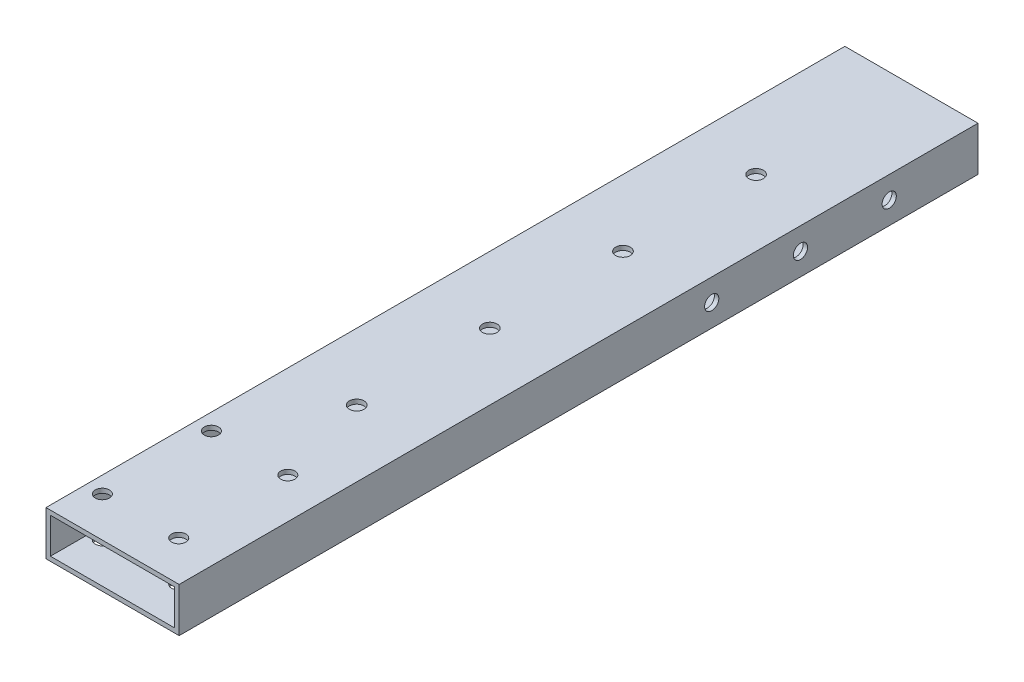
ISO-10303-21;
HEADER;
FILE_DESCRIPTION(('STEP AP214'),'2;1');
FILE_NAME('part.step','',(''),(''),'','','');
FILE_SCHEMA(('AUTOMOTIVE_DESIGN { 1 0 10303 214 1 1 1 1 }'));
ENDSEC;
DATA;
#1=APPLICATION_CONTEXT('core data for automotive mechanical design processes');
#2=APPLICATION_PROTOCOL_DEFINITION('international standard','automotive_design',2000,#1);
#3=PRODUCT_CONTEXT('',#1,'mechanical');
#4=PRODUCT('Part','Part','',(#3));
#5=PRODUCT_RELATED_PRODUCT_CATEGORY('part','',(#4));
#6=PRODUCT_DEFINITION_FORMATION('','',#4);
#7=PRODUCT_DEFINITION_CONTEXT('part definition',#1,'design');
#8=PRODUCT_DEFINITION('design','',#6,#7);
#9=PRODUCT_DEFINITION_SHAPE('','',#8);
#10=(LENGTH_UNIT() NAMED_UNIT(*) SI_UNIT(.MILLI.,.METRE.));
#11=(NAMED_UNIT(*) PLANE_ANGLE_UNIT() SI_UNIT($,.RADIAN.));
#12=(NAMED_UNIT(*) SI_UNIT($,.STERADIAN.) SOLID_ANGLE_UNIT());
#13=UNCERTAINTY_MEASURE_WITH_UNIT(LENGTH_MEASURE(1.E-05),#10,'distance_accuracy_value','');
#14=(GEOMETRIC_REPRESENTATION_CONTEXT(3) GLOBAL_UNCERTAINTY_ASSIGNED_CONTEXT((#13)) GLOBAL_UNIT_ASSIGNED_CONTEXT((#10,
#11,#12)) REPRESENTATION_CONTEXT('',''));
#15=CARTESIAN_POINT('',(0.,0.,0.));
#16=DIRECTION('',(0.,0.,1.));
#17=DIRECTION('',(1.,0.,0.));
#18=AXIS2_PLACEMENT_3D('',#15,#16,#17);
#19=CARTESIAN_POINT('',(15.,5.,330.));
#20=DIRECTION('',(-1.,0.,0.));
#21=DIRECTION('',(0.,0.,1.));
#22=AXIS2_PLACEMENT_3D('',#19,#20,#21);
#23=PLANE('',#22);
#24=CARTESIAN_POINT('',(15.,0.,210.));
#25=DIRECTION('',(-1.,0.,0.));
#26=DIRECTION('',(0.,0.,1.));
#27=AXIS2_PLACEMENT_3D('',#24,#25,#26);
#28=CIRCLE('',#27,1.59999999999996);
#29=CARTESIAN_POINT('',(15.,0.,211.6));
#30=VERTEX_POINT('',#29);
#31=EDGE_CURVE('E230',#30,#30,#28,.T.);
#32=ORIENTED_EDGE('',*,*,#31,.T.);
#33=EDGE_LOOP('',(#32));
#34=FACE_BOUND('',#33,.T.);
#35=CARTESIAN_POINT('',(15.,0.,190.));
#36=DIRECTION('',(-1.,0.,0.));
#37=DIRECTION('',(0.,0.,1.));
#38=AXIS2_PLACEMENT_3D('',#35,#36,#37);
#39=CIRCLE('',#38,1.60000000000002);
#40=CARTESIAN_POINT('',(15.,0.,191.6));
#41=VERTEX_POINT('',#40);
#42=EDGE_CURVE('E241',#41,#41,#39,.T.);
#43=ORIENTED_EDGE('',*,*,#42,.T.);
#44=EDGE_LOOP('',(#43));
#45=FACE_BOUND('',#44,.T.);
#46=CARTESIAN_POINT('',(15.,0.,170.));
#47=DIRECTION('',(-1.,0.,0.));
#48=DIRECTION('',(0.,0.,1.));
#49=AXIS2_PLACEMENT_3D('',#46,#47,#48);
#50=CIRCLE('',#49,1.59999999999999);
#51=CARTESIAN_POINT('',(15.,0.,171.6));
#52=VERTEX_POINT('',#51);
#53=EDGE_CURVE('E231',#52,#52,#50,.T.);
#54=ORIENTED_EDGE('',*,*,#53,.T.);
#55=EDGE_LOOP('',(#54));
#56=FACE_BOUND('',#55,.T.);
#57=DIRECTION('',(0.,-1.,0.));
#58=VECTOR('',#57,1.);
#59=CARTESIAN_POINT('',(15.,5.,150.));
#60=LINE('',#59,#58);
#61=CARTESIAN_POINT('',(15.,5.,150.));
#62=VERTEX_POINT('',#61);
#63=CARTESIAN_POINT('',(15.,-5.,150.));
#64=VERTEX_POINT('',#63);
#65=EDGE_CURVE('E55',#62,#64,#60,.T.);
#66=ORIENTED_EDGE('',*,*,#65,.F.);
#67=DIRECTION('',(0.,0.,-1.));
#68=VECTOR('',#67,1.);
#69=CARTESIAN_POINT('',(15.,5.,330.));
#70=LINE('',#69,#68);
#71=CARTESIAN_POINT('',(15.,5.,330.));
#72=VERTEX_POINT('',#71);
#73=EDGE_CURVE('E48',#72,#62,#70,.T.);
#74=ORIENTED_EDGE('',*,*,#73,.F.);
#75=DIRECTION('',(0.,1.,0.));
#76=VECTOR('',#75,1.);
#77=CARTESIAN_POINT('',(15.,5.,330.));
#78=LINE('',#77,#76);
#79=CARTESIAN_POINT('',(15.,-5.,330.));
#80=VERTEX_POINT('',#79);
#81=EDGE_CURVE('E282',#80,#72,#78,.T.);
#82=ORIENTED_EDGE('',*,*,#81,.F.);
#83=DIRECTION('',(0.,0.,-1.));
#84=VECTOR('',#83,1.);
#85=CARTESIAN_POINT('',(15.,-5.,330.));
#86=LINE('',#85,#84);
#87=EDGE_CURVE('E124',#80,#64,#86,.T.);
#88=ORIENTED_EDGE('',*,*,#87,.T.);
#89=EDGE_LOOP('',(#66,#74,#82,#88));
#90=FACE_BOUND('',#89,.T.);
#91=ADVANCED_FACE('F41',(#34,#45,#56,#90),#23,.F.);
#92=CARTESIAN_POINT('',(-15.,5.,330.));
#93=DIRECTION('',(0.,-1.,0.));
#94=DIRECTION('',(0.,0.,-1.));
#95=AXIS2_PLACEMENT_3D('',#92,#93,#94);
#96=PLANE('',#95);
#97=CARTESIAN_POINT('',(-11.3,5.,321.));
#98=DIRECTION('',(0.,1.,0.));
#99=DIRECTION('',(0.,0.,1.));
#100=AXIS2_PLACEMENT_3D('',#97,#98,#99);
#101=CIRCLE('',#100,1.59999999999998);
#102=CARTESIAN_POINT('',(-11.3,5.,322.6));
#103=VERTEX_POINT('',#102);
#104=EDGE_CURVE('E252',#103,#103,#101,.T.);
#105=ORIENTED_EDGE('',*,*,#104,.F.);
#106=EDGE_LOOP('',(#105));
#107=FACE_BOUND('',#106,.T.);
#108=CARTESIAN_POINT('',(-6.66133814775094E-12,5.,245.));
#109=DIRECTION('',(0.,1.,0.));
#110=DIRECTION('',(0.,0.,1.));
#111=AXIS2_PLACEMENT_3D('',#108,#109,#110);
#112=CIRCLE('',#111,1.65000000000881);
#113=CARTESIAN_POINT('',(-6.66133814775094E-12,5.,246.650000000009));
#114=VERTEX_POINT('',#113);
#115=EDGE_CURVE('E274',#114,#114,#112,.T.);
#116=ORIENTED_EDGE('',*,*,#115,.F.);
#117=EDGE_LOOP('',(#116));
#118=FACE_BOUND('',#117,.T.);
#119=CARTESIAN_POINT('',(-6.43929354282591E-12,5.,275.));
#120=DIRECTION('',(0.,1.,0.));
#121=DIRECTION('',(0.,0.,1.));
#122=AXIS2_PLACEMENT_3D('',#119,#120,#121);
#123=CIRCLE('',#122,1.6500000000061);
#124=CARTESIAN_POINT('',(-6.43929354282591E-12,5.,276.650000000006));
#125=VERTEX_POINT('',#124);
#126=EDGE_CURVE('E268',#125,#125,#123,.T.);
#127=ORIENTED_EDGE('',*,*,#126,.F.);
#128=EDGE_LOOP('',(#127));
#129=FACE_BOUND('',#128,.T.);
#130=CARTESIAN_POINT('',(-6.66133814775094E-12,5.,185.));
#131=DIRECTION('',(0.,1.,0.));
#132=DIRECTION('',(0.,0.,1.));
#133=AXIS2_PLACEMENT_3D('',#130,#131,#132);
#134=CIRCLE('',#133,1.65000000000584);
#135=CARTESIAN_POINT('',(-6.66133814775094E-12,5.,186.650000000006));
#136=VERTEX_POINT('',#135);
#137=EDGE_CURVE('E262',#136,#136,#134,.T.);
#138=ORIENTED_EDGE('',*,*,#137,.F.);
#139=EDGE_LOOP('',(#138));
#140=FACE_BOUND('',#139,.T.);
#141=CARTESIAN_POINT('',(-6.43929354282591E-12,5.,215.));
#142=DIRECTION('',(0.,1.,0.));
#143=DIRECTION('',(0.,0.,1.));
#144=AXIS2_PLACEMENT_3D('',#141,#142,#143);
#145=CIRCLE('',#144,1.65000000000618);
#146=CARTESIAN_POINT('',(-6.43929354282591E-12,5.,216.650000000006));
#147=VERTEX_POINT('',#146);
#148=EDGE_CURVE('E256',#147,#147,#145,.T.);
#149=ORIENTED_EDGE('',*,*,#148,.F.);
#150=EDGE_LOOP('',(#149));
#151=FACE_BOUND('',#150,.T.);
#152=CARTESIAN_POINT('',(5.90729309052507,5.,296.425438671338));
#153=DIRECTION('',(0.,1.,0.));
#154=DIRECTION('',(0.,0.,1.));
#155=AXIS2_PLACEMENT_3D('',#152,#153,#154);
#156=CIRCLE('',#155,1.60000000000869);
#157=CARTESIAN_POINT('',(5.90729309052507,5.,298.025438671347));
#158=VERTEX_POINT('',#157);
#159=EDGE_CURVE('E253',#158,#158,#156,.T.);
#160=ORIENTED_EDGE('',*,*,#159,.F.);
#161=EDGE_LOOP('',(#160));
#162=FACE_BOUND('',#161,.T.);
#163=CARTESIAN_POINT('',(-11.3,5.,296.425438671338));
#164=DIRECTION('',(0.,1.,0.));
#165=DIRECTION('',(0.,0.,1.));
#166=AXIS2_PLACEMENT_3D('',#163,#164,#165);
#167=CIRCLE('',#166,1.6);
#168=CARTESIAN_POINT('',(-11.3,5.,298.025438671338));
#169=VERTEX_POINT('',#168);
#170=EDGE_CURVE('E304',#169,#169,#167,.T.);
#171=ORIENTED_EDGE('',*,*,#170,.F.);
#172=EDGE_LOOP('',(#171));
#173=FACE_BOUND('',#172,.T.);
#174=CARTESIAN_POINT('',(5.90729309052507,5.,321.));
#175=DIRECTION('',(0.,1.,0.));
#176=DIRECTION('',(0.,0.,1.));
#177=AXIS2_PLACEMENT_3D('',#174,#175,#176);
#178=CIRCLE('',#177,1.59999999999999);
#179=CARTESIAN_POINT('',(5.90729309052507,5.,322.6));
#180=VERTEX_POINT('',#179);
#181=EDGE_CURVE('E155',#180,#180,#178,.T.);
#182=ORIENTED_EDGE('',*,*,#181,.F.);
#183=EDGE_LOOP('',(#182));
#184=FACE_BOUND('',#183,.T.);
#185=DIRECTION('',(1.,0.,0.));
#186=VECTOR('',#185,1.);
#187=CARTESIAN_POINT('',(15.,5.,150.));
#188=LINE('',#187,#186);
#189=CARTESIAN_POINT('',(-15.,5.,150.));
#190=VERTEX_POINT('',#189);
#191=EDGE_CURVE('E120',#190,#62,#188,.T.);
#192=ORIENTED_EDGE('',*,*,#191,.F.);
#193=DIRECTION('',(0.,0.,-1.));
#194=VECTOR('',#193,1.);
#195=CARTESIAN_POINT('',(-15.,5.,330.));
#196=LINE('',#195,#194);
#197=CARTESIAN_POINT('',(-15.,5.,330.));
#198=VERTEX_POINT('',#197);
#199=EDGE_CURVE('E119',#198,#190,#196,.T.);
#200=ORIENTED_EDGE('',*,*,#199,.F.);
#201=DIRECTION('',(-1.,0.,0.));
#202=VECTOR('',#201,1.);
#203=CARTESIAN_POINT('',(-15.,5.,330.));
#204=LINE('',#203,#202);
#205=EDGE_CURVE('E287',#72,#198,#204,.T.);
#206=ORIENTED_EDGE('',*,*,#205,.F.);
#207=ORIENTED_EDGE('',*,*,#73,.T.);
#208=EDGE_LOOP('',(#192,#200,#206,#207));
#209=FACE_BOUND('',#208,.T.);
#210=ADVANCED_FACE('F296',(#107,#118,#129,#140,#151,#162,#173,#184,#209),#96,.F.);
#211=CARTESIAN_POINT('',(-15.,5.,330.));
#212=DIRECTION('',(1.,0.,0.));
#213=DIRECTION('',(0.,1.,0.));
#214=AXIS2_PLACEMENT_3D('',#211,#212,#213);
#215=PLANE('',#214);
#216=CARTESIAN_POINT('',(-15.,0.,210.));
#217=DIRECTION('',(-1.,0.,0.));
#218=DIRECTION('',(0.,0.,1.));
#219=AXIS2_PLACEMENT_3D('',#216,#217,#218);
#220=CIRCLE('',#219,1.59999999999996);
#221=CARTESIAN_POINT('',(-15.,0.,211.6));
#222=VERTEX_POINT('',#221);
#223=EDGE_CURVE('E244',#222,#222,#220,.T.);
#224=ORIENTED_EDGE('',*,*,#223,.F.);
#225=EDGE_LOOP('',(#224));
#226=FACE_BOUND('',#225,.T.);
#227=CARTESIAN_POINT('',(-15.,0.,190.));
#228=DIRECTION('',(-1.,0.,0.));
#229=DIRECTION('',(0.,0.,1.));
#230=AXIS2_PLACEMENT_3D('',#227,#228,#229);
#231=CIRCLE('',#230,1.60000000000002);
#232=CARTESIAN_POINT('',(-15.,0.,191.6));
#233=VERTEX_POINT('',#232);
#234=EDGE_CURVE('E238',#233,#233,#231,.T.);
#235=ORIENTED_EDGE('',*,*,#234,.F.);
#236=EDGE_LOOP('',(#235));
#237=FACE_BOUND('',#236,.T.);
#238=CARTESIAN_POINT('',(-15.,0.,170.));
#239=DIRECTION('',(-1.,0.,0.));
#240=DIRECTION('',(0.,0.,1.));
#241=AXIS2_PLACEMENT_3D('',#238,#239,#240);
#242=CIRCLE('',#241,1.59999999999999);
#243=CARTESIAN_POINT('',(-15.,0.,171.6));
#244=VERTEX_POINT('',#243);
#245=EDGE_CURVE('E235',#244,#244,#242,.T.);
#246=ORIENTED_EDGE('',*,*,#245,.F.);
#247=EDGE_LOOP('',(#246));
#248=FACE_BOUND('',#247,.T.);
#249=DIRECTION('',(0.,1.,0.));
#250=VECTOR('',#249,1.);
#251=CARTESIAN_POINT('',(-15.,5.,150.));
#252=LINE('',#251,#250);
#253=CARTESIAN_POINT('',(-15.,-5.,150.));
#254=VERTEX_POINT('',#253);
#255=EDGE_CURVE('E104',#254,#190,#252,.T.);
#256=ORIENTED_EDGE('',*,*,#255,.F.);
#257=DIRECTION('',(0.,0.,-1.));
#258=VECTOR('',#257,1.);
#259=CARTESIAN_POINT('',(-15.,-5.,330.));
#260=LINE('',#259,#258);
#261=CARTESIAN_POINT('',(-15.,-5.,330.));
#262=VERTEX_POINT('',#261);
#263=EDGE_CURVE('E116',#262,#254,#260,.T.);
#264=ORIENTED_EDGE('',*,*,#263,.F.);
#265=DIRECTION('',(0.,-1.,0.));
#266=VECTOR('',#265,1.);
#267=CARTESIAN_POINT('',(-15.,5.,330.));
#268=LINE('',#267,#266);
#269=EDGE_CURVE('E289',#198,#262,#268,.T.);
#270=ORIENTED_EDGE('',*,*,#269,.F.);
#271=ORIENTED_EDGE('',*,*,#199,.T.);
#272=EDGE_LOOP('',(#256,#264,#270,#271));
#273=FACE_BOUND('',#272,.T.);
#274=ADVANCED_FACE('F114',(#226,#237,#248,#273),#215,.F.);
#275=CARTESIAN_POINT('',(-15.,-5.,330.));
#276=DIRECTION('',(0.,1.,0.));
#277=DIRECTION('',(0.,0.,1.));
#278=AXIS2_PLACEMENT_3D('',#275,#276,#277);
#279=PLANE('',#278);
#280=CARTESIAN_POINT('',(-11.3,-5.,321.));
#281=DIRECTION('',(0.,1.,0.));
#282=DIRECTION('',(0.,0.,1.));
#283=AXIS2_PLACEMENT_3D('',#280,#281,#282);
#284=CIRCLE('',#283,1.59999999999998);
#285=CARTESIAN_POINT('',(-11.3,-5.,322.6));
#286=VERTEX_POINT('',#285);
#287=EDGE_CURVE('E279',#286,#286,#284,.T.);
#288=ORIENTED_EDGE('',*,*,#287,.T.);
#289=EDGE_LOOP('',(#288));
#290=FACE_BOUND('',#289,.T.);
#291=CARTESIAN_POINT('',(-6.66133814775094E-12,-5.,245.));
#292=DIRECTION('',(0.,1.,0.));
#293=DIRECTION('',(0.,0.,1.));
#294=AXIS2_PLACEMENT_3D('',#291,#292,#293);
#295=CIRCLE('',#294,1.65000000000881);
#296=CARTESIAN_POINT('',(-6.66133814775094E-12,-5.,246.650000000009));
#297=VERTEX_POINT('',#296);
#298=EDGE_CURVE('E234',#297,#297,#295,.T.);
#299=ORIENTED_EDGE('',*,*,#298,.T.);
#300=EDGE_LOOP('',(#299));
#301=FACE_BOUND('',#300,.T.);
#302=CARTESIAN_POINT('',(-6.43929354282591E-12,-5.,275.));
#303=DIRECTION('',(0.,1.,0.));
#304=DIRECTION('',(0.,0.,1.));
#305=AXIS2_PLACEMENT_3D('',#302,#303,#304);
#306=CIRCLE('',#305,1.6500000000061);
#307=CARTESIAN_POINT('',(-6.43929354282591E-12,-5.,276.650000000006));
#308=VERTEX_POINT('',#307);
#309=EDGE_CURVE('E271',#308,#308,#306,.T.);
#310=ORIENTED_EDGE('',*,*,#309,.T.);
#311=EDGE_LOOP('',(#310));
#312=FACE_BOUND('',#311,.T.);
#313=CARTESIAN_POINT('',(-6.66133814775094E-12,-5.,185.));
#314=DIRECTION('',(0.,1.,0.));
#315=DIRECTION('',(0.,0.,1.));
#316=AXIS2_PLACEMENT_3D('',#313,#314,#315);
#317=CIRCLE('',#316,1.65000000000584);
#318=CARTESIAN_POINT('',(-6.66133814775094E-12,-5.,186.650000000006));
#319=VERTEX_POINT('',#318);
#320=EDGE_CURVE('E265',#319,#319,#317,.T.);
#321=ORIENTED_EDGE('',*,*,#320,.T.);
#322=EDGE_LOOP('',(#321));
#323=FACE_BOUND('',#322,.T.);
#324=CARTESIAN_POINT('',(-6.43929354282591E-12,-5.,215.));
#325=DIRECTION('',(0.,1.,0.));
#326=DIRECTION('',(0.,0.,1.));
#327=AXIS2_PLACEMENT_3D('',#324,#325,#326);
#328=CIRCLE('',#327,1.65000000000618);
#329=CARTESIAN_POINT('',(-6.43929354282591E-12,-5.,216.650000000006));
#330=VERTEX_POINT('',#329);
#331=EDGE_CURVE('E259',#330,#330,#328,.T.);
#332=ORIENTED_EDGE('',*,*,#331,.T.);
#333=EDGE_LOOP('',(#332));
#334=FACE_BOUND('',#333,.T.);
#335=CARTESIAN_POINT('',(5.90729309052507,-5.,296.425438671338));
#336=DIRECTION('',(0.,1.,0.));
#337=DIRECTION('',(0.,0.,1.));
#338=AXIS2_PLACEMENT_3D('',#335,#336,#337);
#339=CIRCLE('',#338,1.60000000000869);
#340=CARTESIAN_POINT('',(5.90729309052507,-5.,298.025438671347));
#341=VERTEX_POINT('',#340);
#342=EDGE_CURVE('E249',#341,#341,#339,.T.);
#343=ORIENTED_EDGE('',*,*,#342,.T.);
#344=EDGE_LOOP('',(#343));
#345=FACE_BOUND('',#344,.T.);
#346=CARTESIAN_POINT('',(-11.3,-5.,296.425438671338));
#347=DIRECTION('',(0.,1.,0.));
#348=DIRECTION('',(0.,0.,1.));
#349=AXIS2_PLACEMENT_3D('',#346,#347,#348);
#350=CIRCLE('',#349,1.6);
#351=CARTESIAN_POINT('',(-11.3,-5.,298.025438671338));
#352=VERTEX_POINT('',#351);
#353=EDGE_CURVE('E159',#352,#352,#350,.T.);
#354=ORIENTED_EDGE('',*,*,#353,.T.);
#355=EDGE_LOOP('',(#354));
#356=FACE_BOUND('',#355,.T.);
#357=CARTESIAN_POINT('',(5.90729309052507,-5.,321.));
#358=DIRECTION('',(0.,1.,0.));
#359=DIRECTION('',(0.,0.,1.));
#360=AXIS2_PLACEMENT_3D('',#357,#358,#359);
#361=CIRCLE('',#360,1.59999999999999);
#362=CARTESIAN_POINT('',(5.90729309052507,-5.,322.6));
#363=VERTEX_POINT('',#362);
#364=EDGE_CURVE('E163',#363,#363,#361,.T.);
#365=ORIENTED_EDGE('',*,*,#364,.T.);
#366=EDGE_LOOP('',(#365));
#367=FACE_BOUND('',#366,.T.);
#368=DIRECTION('',(-1.,0.,0.));
#369=VECTOR('',#368,1.);
#370=CARTESIAN_POINT('',(15.,-5.,150.));
#371=LINE('',#370,#369);
#372=EDGE_CURVE('E101',#64,#254,#371,.T.);
#373=ORIENTED_EDGE('',*,*,#372,.F.);
#374=ORIENTED_EDGE('',*,*,#87,.F.);
#375=DIRECTION('',(1.,0.,0.));
#376=VECTOR('',#375,1.);
#377=CARTESIAN_POINT('',(-15.,-5.,330.));
#378=LINE('',#377,#376);
#379=EDGE_CURVE('E123',#262,#80,#378,.T.);
#380=ORIENTED_EDGE('',*,*,#379,.F.);
#381=ORIENTED_EDGE('',*,*,#263,.T.);
#382=EDGE_LOOP('',(#373,#374,#380,#381));
#383=FACE_BOUND('',#382,.T.);
#384=ADVANCED_FACE('F122',(#290,#301,#312,#323,#334,#345,#356,#367,#383),#279,.F.);
#385=CARTESIAN_POINT('',(14.,-4.,355.));
#386=DIRECTION('',(0.,-1.,0.));
#387=DIRECTION('',(0.,0.,-1.));
#388=AXIS2_PLACEMENT_3D('',#385,#386,#387);
#389=PLANE('',#388);
#390=CARTESIAN_POINT('',(-11.3,-4.,321.));
#391=DIRECTION('',(0.,-1.,0.));
#392=DIRECTION('',(0.,0.,-1.));
#393=AXIS2_PLACEMENT_3D('',#390,#391,#392);
#394=CIRCLE('',#393,1.59999999999998);
#395=CARTESIAN_POINT('',(-11.3,-4.,319.4));
#396=VERTEX_POINT('',#395);
#397=EDGE_CURVE('E225',#396,#396,#394,.F.);
#398=ORIENTED_EDGE('',*,*,#397,.F.);
#399=EDGE_LOOP('',(#398));
#400=FACE_BOUND('',#399,.T.);
#401=CARTESIAN_POINT('',(-6.43929354282591E-12,-4.,275.));
#402=DIRECTION('',(0.,-1.,0.));
#403=DIRECTION('',(0.,0.,-1.));
#404=AXIS2_PLACEMENT_3D('',#401,#402,#403);
#405=CIRCLE('',#404,1.6500000000061);
#406=CARTESIAN_POINT('',(-6.43929354282591E-12,-4.,273.349999999994));
#407=VERTEX_POINT('',#406);
#408=EDGE_CURVE('E219',#407,#407,#405,.F.);
#409=ORIENTED_EDGE('',*,*,#408,.F.);
#410=EDGE_LOOP('',(#409));
#411=FACE_BOUND('',#410,.T.);
#412=CARTESIAN_POINT('',(-6.43929354282591E-12,-4.,215.));
#413=DIRECTION('',(0.,-1.,0.));
#414=DIRECTION('',(0.,0.,-1.));
#415=AXIS2_PLACEMENT_3D('',#412,#413,#414);
#416=CIRCLE('',#415,1.65000000000618);
#417=CARTESIAN_POINT('',(-6.43929354282591E-12,-4.,213.349999999994));
#418=VERTEX_POINT('',#417);
#419=EDGE_CURVE('E150',#418,#418,#416,.F.);
#420=ORIENTED_EDGE('',*,*,#419,.F.);
#421=EDGE_LOOP('',(#420));
#422=FACE_BOUND('',#421,.T.);
#423=CARTESIAN_POINT('',(5.90729309052507,-4.,296.425438671338));
#424=DIRECTION('',(0.,-1.,0.));
#425=DIRECTION('',(0.,0.,-1.));
#426=AXIS2_PLACEMENT_3D('',#423,#424,#425);
#427=CIRCLE('',#426,1.60000000000869);
#428=CARTESIAN_POINT('',(5.90729309052507,-4.,294.82543867133));
#429=VERTEX_POINT('',#428);
#430=EDGE_CURVE('E147',#429,#429,#427,.F.);
#431=ORIENTED_EDGE('',*,*,#430,.F.);
#432=EDGE_LOOP('',(#431));
#433=FACE_BOUND('',#432,.T.);
#434=CARTESIAN_POINT('',(-6.66133814775094E-12,-4.,185.));
#435=DIRECTION('',(0.,-1.,0.));
#436=DIRECTION('',(0.,0.,-1.));
#437=AXIS2_PLACEMENT_3D('',#434,#435,#436);
#438=CIRCLE('',#437,1.65000000000584);
#439=CARTESIAN_POINT('',(-6.66133814775094E-12,-4.,183.349999999994));
#440=VERTEX_POINT('',#439);
#441=EDGE_CURVE('E216',#440,#440,#438,.F.);
#442=ORIENTED_EDGE('',*,*,#441,.F.);
#443=EDGE_LOOP('',(#442));
#444=FACE_BOUND('',#443,.T.);
#445=CARTESIAN_POINT('',(-6.66133814775094E-12,-4.,245.));
#446=DIRECTION('',(0.,-1.,0.));
#447=DIRECTION('',(0.,0.,-1.));
#448=AXIS2_PLACEMENT_3D('',#445,#446,#447);
#449=CIRCLE('',#448,1.65000000000881);
#450=CARTESIAN_POINT('',(-6.66133814775094E-12,-4.,243.349999999991));
#451=VERTEX_POINT('',#450);
#452=EDGE_CURVE('E222',#451,#451,#449,.F.);
#453=ORIENTED_EDGE('',*,*,#452,.F.);
#454=EDGE_LOOP('',(#453));
#455=FACE_BOUND('',#454,.T.);
#456=CARTESIAN_POINT('',(-11.3,-4.,296.425438671338));
#457=DIRECTION('',(0.,-1.,0.));
#458=DIRECTION('',(0.,0.,-1.));
#459=AXIS2_PLACEMENT_3D('',#456,#457,#458);
#460=CIRCLE('',#459,1.6);
#461=CARTESIAN_POINT('',(-11.3,-4.,294.825438671338));
#462=VERTEX_POINT('',#461);
#463=EDGE_CURVE('E154',#462,#462,#460,.T.);
#464=ORIENTED_EDGE('',*,*,#463,.T.);
#465=EDGE_LOOP('',(#464));
#466=FACE_BOUND('',#465,.T.);
#467=CARTESIAN_POINT('',(5.90729309052507,-4.,321.));
#468=DIRECTION('',(0.,-1.,0.));
#469=DIRECTION('',(0.,0.,-1.));
#470=AXIS2_PLACEMENT_3D('',#467,#468,#469);
#471=CIRCLE('',#470,1.59999999999999);
#472=CARTESIAN_POINT('',(5.90729309052507,-4.,319.4));
#473=VERTEX_POINT('',#472);
#474=EDGE_CURVE('E158',#473,#473,#471,.T.);
#475=ORIENTED_EDGE('',*,*,#474,.T.);
#476=EDGE_LOOP('',(#475));
#477=FACE_BOUND('',#476,.T.);
#478=DIRECTION('',(1.,0.,0.));
#479=VECTOR('',#478,1.);
#480=CARTESIAN_POINT('',(14.,-4.,150.));
#481=LINE('',#480,#479);
#482=CARTESIAN_POINT('',(-14.,-4.,150.));
#483=VERTEX_POINT('',#482);
#484=CARTESIAN_POINT('',(14.,-4.,150.));
#485=VERTEX_POINT('',#484);
#486=EDGE_CURVE('E62',#483,#485,#481,.T.);
#487=ORIENTED_EDGE('',*,*,#486,.F.);
#488=DIRECTION('',(0.,0.,-1.));
#489=VECTOR('',#488,1.);
#490=CARTESIAN_POINT('',(-14.,-4.,355.));
#491=LINE('',#490,#489);
#492=CARTESIAN_POINT('',(-14.,-4.,330.));
#493=VERTEX_POINT('',#492);
#494=EDGE_CURVE('E181',#493,#483,#491,.T.);
#495=ORIENTED_EDGE('',*,*,#494,.F.);
#496=DIRECTION('',(1.,0.,0.));
#497=VECTOR('',#496,1.);
#498=CARTESIAN_POINT('',(0.,-4.,330.));
#499=LINE('',#498,#497);
#500=CARTESIAN_POINT('',(14.,-4.,330.));
#501=VERTEX_POINT('',#500);
#502=EDGE_CURVE('E228',#493,#501,#499,.T.);
#503=ORIENTED_EDGE('',*,*,#502,.T.);
#504=DIRECTION('',(0.,0.,-1.));
#505=VECTOR('',#504,1.);
#506=CARTESIAN_POINT('',(14.,-4.,355.));
#507=LINE('',#506,#505);
#508=EDGE_CURVE('E175',#501,#485,#507,.T.);
#509=ORIENTED_EDGE('',*,*,#508,.T.);
#510=EDGE_LOOP('',(#487,#495,#503,#509));
#511=FACE_BOUND('',#510,.T.);
#512=ADVANCED_FACE('F376',(#400,#411,#422,#433,#444,#455,#466,#477,#511),#389,.F.);
#513=CARTESIAN_POINT('',(14.,4.,355.));
#514=DIRECTION('',(0.,1.,0.));
#515=DIRECTION('',(0.,0.,1.));
#516=AXIS2_PLACEMENT_3D('',#513,#514,#515);
#517=PLANE('',#516);
#518=CARTESIAN_POINT('',(-11.3,4.,321.));
#519=DIRECTION('',(0.,1.,0.));
#520=DIRECTION('',(0.,0.,1.));
#521=AXIS2_PLACEMENT_3D('',#518,#519,#520);
#522=CIRCLE('',#521,1.59999999999998);
#523=CARTESIAN_POINT('',(-11.3,4.,322.6));
#524=VERTEX_POINT('',#523);
#525=EDGE_CURVE('E210',#524,#524,#522,.F.);
#526=ORIENTED_EDGE('',*,*,#525,.F.);
#527=EDGE_LOOP('',(#526));
#528=FACE_BOUND('',#527,.T.);
#529=CARTESIAN_POINT('',(-6.43929354282591E-12,4.,275.));
#530=DIRECTION('',(0.,1.,0.));
#531=DIRECTION('',(0.,0.,1.));
#532=AXIS2_PLACEMENT_3D('',#529,#530,#531);
#533=CIRCLE('',#532,1.6500000000061);
#534=CARTESIAN_POINT('',(-6.43929354282591E-12,4.,276.650000000006));
#535=VERTEX_POINT('',#534);
#536=EDGE_CURVE('E204',#535,#535,#533,.F.);
#537=ORIENTED_EDGE('',*,*,#536,.F.);
#538=EDGE_LOOP('',(#537));
#539=FACE_BOUND('',#538,.T.);
#540=CARTESIAN_POINT('',(-6.43929354282591E-12,4.,215.));
#541=DIRECTION('',(0.,1.,0.));
#542=DIRECTION('',(0.,0.,1.));
#543=AXIS2_PLACEMENT_3D('',#540,#541,#542);
#544=CIRCLE('',#543,1.65000000000618);
#545=CARTESIAN_POINT('',(-6.43929354282591E-12,4.,216.650000000006));
#546=VERTEX_POINT('',#545);
#547=EDGE_CURVE('E145',#546,#546,#544,.F.);
#548=ORIENTED_EDGE('',*,*,#547,.F.);
#549=EDGE_LOOP('',(#548));
#550=FACE_BOUND('',#549,.T.);
#551=CARTESIAN_POINT('',(5.90729309052507,4.,296.425438671338));
#552=DIRECTION('',(0.,1.,0.));
#553=DIRECTION('',(0.,0.,1.));
#554=AXIS2_PLACEMENT_3D('',#551,#552,#553);
#555=CIRCLE('',#554,1.60000000000869);
#556=CARTESIAN_POINT('',(5.90729309052507,4.,298.025438671347));
#557=VERTEX_POINT('',#556);
#558=EDGE_CURVE('E142',#557,#557,#555,.F.);
#559=ORIENTED_EDGE('',*,*,#558,.F.);
#560=EDGE_LOOP('',(#559));
#561=FACE_BOUND('',#560,.T.);
#562=CARTESIAN_POINT('',(-6.66133814775094E-12,4.,185.));
#563=DIRECTION('',(0.,1.,0.));
#564=DIRECTION('',(0.,0.,1.));
#565=AXIS2_PLACEMENT_3D('',#562,#563,#564);
#566=CIRCLE('',#565,1.65000000000584);
#567=CARTESIAN_POINT('',(-6.66133814775094E-12,4.,186.650000000006));
#568=VERTEX_POINT('',#567);
#569=EDGE_CURVE('E201',#568,#568,#566,.F.);
#570=ORIENTED_EDGE('',*,*,#569,.F.);
#571=EDGE_LOOP('',(#570));
#572=FACE_BOUND('',#571,.T.);
#573=CARTESIAN_POINT('',(-6.66133814775094E-12,4.,245.));
#574=DIRECTION('',(0.,1.,0.));
#575=DIRECTION('',(0.,0.,1.));
#576=AXIS2_PLACEMENT_3D('',#573,#574,#575);
#577=CIRCLE('',#576,1.65000000000881);
#578=CARTESIAN_POINT('',(-6.66133814775094E-12,4.,246.650000000009));
#579=VERTEX_POINT('',#578);
#580=EDGE_CURVE('E207',#579,#579,#577,.F.);
#581=ORIENTED_EDGE('',*,*,#580,.F.);
#582=EDGE_LOOP('',(#581));
#583=FACE_BOUND('',#582,.T.);
#584=CARTESIAN_POINT('',(-11.3,4.,296.425438671338));
#585=DIRECTION('',(0.,1.,0.));
#586=DIRECTION('',(0.,0.,1.));
#587=AXIS2_PLACEMENT_3D('',#584,#585,#586);
#588=CIRCLE('',#587,1.6);
#589=CARTESIAN_POINT('',(-11.3,4.,298.025438671338));
#590=VERTEX_POINT('',#589);
#591=EDGE_CURVE('E152',#590,#590,#588,.T.);
#592=ORIENTED_EDGE('',*,*,#591,.T.);
#593=EDGE_LOOP('',(#592));
#594=FACE_BOUND('',#593,.T.);
#595=CARTESIAN_POINT('',(5.90729309052507,4.,321.));
#596=DIRECTION('',(0.,1.,0.));
#597=DIRECTION('',(0.,0.,1.));
#598=AXIS2_PLACEMENT_3D('',#595,#596,#597);
#599=CIRCLE('',#598,1.59999999999999);
#600=CARTESIAN_POINT('',(5.90729309052507,4.,322.6));
#601=VERTEX_POINT('',#600);
#602=EDGE_CURVE('E156',#601,#601,#599,.T.);
#603=ORIENTED_EDGE('',*,*,#602,.T.);
#604=EDGE_LOOP('',(#603));
#605=FACE_BOUND('',#604,.T.);
#606=DIRECTION('',(-1.,0.,0.));
#607=VECTOR('',#606,1.);
#608=CARTESIAN_POINT('',(14.,4.,150.));
#609=LINE('',#608,#607);
#610=CARTESIAN_POINT('',(14.,4.,150.));
#611=VERTEX_POINT('',#610);
#612=CARTESIAN_POINT('',(-14.,4.,150.));
#613=VERTEX_POINT('',#612);
#614=EDGE_CURVE('E297',#611,#613,#609,.T.);
#615=ORIENTED_EDGE('',*,*,#614,.F.);
#616=DIRECTION('',(0.,0.,-1.));
#617=VECTOR('',#616,1.);
#618=CARTESIAN_POINT('',(14.,4.,355.));
#619=LINE('',#618,#617);
#620=CARTESIAN_POINT('',(14.,4.,330.));
#621=VERTEX_POINT('',#620);
#622=EDGE_CURVE('E136',#621,#611,#619,.T.);
#623=ORIENTED_EDGE('',*,*,#622,.F.);
#624=DIRECTION('',(-1.,0.,0.));
#625=VECTOR('',#624,1.);
#626=CARTESIAN_POINT('',(0.,4.,330.));
#627=LINE('',#626,#625);
#628=CARTESIAN_POINT('',(-14.,4.,330.));
#629=VERTEX_POINT('',#628);
#630=EDGE_CURVE('E151',#621,#629,#627,.T.);
#631=ORIENTED_EDGE('',*,*,#630,.T.);
#632=DIRECTION('',(0.,0.,-1.));
#633=VECTOR('',#632,1.);
#634=CARTESIAN_POINT('',(-14.,4.,355.));
#635=LINE('',#634,#633);
#636=EDGE_CURVE('E178',#629,#613,#635,.T.);
#637=ORIENTED_EDGE('',*,*,#636,.T.);
#638=EDGE_LOOP('',(#615,#623,#631,#637));
#639=FACE_BOUND('',#638,.T.);
#640=ADVANCED_FACE('F427',(#528,#539,#550,#561,#572,#583,#594,#605,#639),#517,.F.);
#641=CARTESIAN_POINT('',(-14.,4.,355.));
#642=DIRECTION('',(-1.,0.,0.));
#643=DIRECTION('',(0.,0.,1.));
#644=AXIS2_PLACEMENT_3D('',#641,#642,#643);
#645=PLANE('',#644);
#646=CARTESIAN_POINT('',(-14.,0.,210.));
#647=DIRECTION('',(-1.,0.,0.));
#648=DIRECTION('',(0.,0.,1.));
#649=AXIS2_PLACEMENT_3D('',#646,#647,#648);
#650=CIRCLE('',#649,1.59999999999996);
#651=CARTESIAN_POINT('',(-14.,0.,211.6));
#652=VERTEX_POINT('',#651);
#653=EDGE_CURVE('E194',#652,#652,#650,.F.);
#654=ORIENTED_EDGE('',*,*,#653,.F.);
#655=EDGE_LOOP('',(#654));
#656=FACE_BOUND('',#655,.T.);
#657=CARTESIAN_POINT('',(-14.,0.,170.));
#658=DIRECTION('',(-1.,0.,0.));
#659=DIRECTION('',(0.,0.,1.));
#660=AXIS2_PLACEMENT_3D('',#657,#658,#659);
#661=CIRCLE('',#660,1.59999999999999);
#662=CARTESIAN_POINT('',(-14.,0.,171.6));
#663=VERTEX_POINT('',#662);
#664=EDGE_CURVE('E137',#663,#663,#661,.F.);
#665=ORIENTED_EDGE('',*,*,#664,.F.);
#666=EDGE_LOOP('',(#665));
#667=FACE_BOUND('',#666,.T.);
#668=CARTESIAN_POINT('',(-14.,0.,190.));
#669=DIRECTION('',(-1.,0.,0.));
#670=DIRECTION('',(0.,0.,1.));
#671=AXIS2_PLACEMENT_3D('',#668,#669,#670);
#672=CIRCLE('',#671,1.60000000000002);
#673=CARTESIAN_POINT('',(-14.,0.,191.6));
#674=VERTEX_POINT('',#673);
#675=EDGE_CURVE('E140',#674,#674,#672,.F.);
#676=ORIENTED_EDGE('',*,*,#675,.F.);
#677=EDGE_LOOP('',(#676));
#678=FACE_BOUND('',#677,.T.);
#679=DIRECTION('',(0.,-1.,0.));
#680=VECTOR('',#679,1.);
#681=CARTESIAN_POINT('',(-14.,4.,150.));
#682=LINE('',#681,#680);
#683=EDGE_CURVE('E302',#613,#483,#682,.T.);
#684=ORIENTED_EDGE('',*,*,#683,.F.);
#685=ORIENTED_EDGE('',*,*,#636,.F.);
#686=DIRECTION('',(0.,-1.,0.));
#687=VECTOR('',#686,1.);
#688=CARTESIAN_POINT('',(-14.,0.,330.));
#689=LINE('',#688,#687);
#690=EDGE_CURVE('E146',#629,#493,#689,.T.);
#691=ORIENTED_EDGE('',*,*,#690,.T.);
#692=ORIENTED_EDGE('',*,*,#494,.T.);
#693=EDGE_LOOP('',(#684,#685,#691,#692));
#694=FACE_BOUND('',#693,.T.);
#695=ADVANCED_FACE('F424',(#656,#667,#678,#694),#645,.F.);
#696=CARTESIAN_POINT('',(14.,4.,355.));
#697=DIRECTION('',(1.,0.,0.));
#698=DIRECTION('',(0.,1.,0.));
#699=AXIS2_PLACEMENT_3D('',#696,#697,#698);
#700=PLANE('',#699);
#701=CARTESIAN_POINT('',(14.,0.,210.));
#702=DIRECTION('',(1.,0.,0.));
#703=DIRECTION('',(0.,1.,0.));
#704=AXIS2_PLACEMENT_3D('',#701,#702,#703);
#705=CIRCLE('',#704,1.59999999999996);
#706=CARTESIAN_POINT('',(14.,1.59999999999996,210.));
#707=VERTEX_POINT('',#706);
#708=EDGE_CURVE('E188',#707,#707,#705,.F.);
#709=ORIENTED_EDGE('',*,*,#708,.F.);
#710=EDGE_LOOP('',(#709));
#711=FACE_BOUND('',#710,.T.);
#712=CARTESIAN_POINT('',(14.,0.,170.));
#713=DIRECTION('',(1.,0.,0.));
#714=DIRECTION('',(0.,1.,0.));
#715=AXIS2_PLACEMENT_3D('',#712,#713,#714);
#716=CIRCLE('',#715,1.59999999999999);
#717=CARTESIAN_POINT('',(14.,1.59999999999999,170.));
#718=VERTEX_POINT('',#717);
#719=EDGE_CURVE('E132',#718,#718,#716,.F.);
#720=ORIENTED_EDGE('',*,*,#719,.F.);
#721=EDGE_LOOP('',(#720));
#722=FACE_BOUND('',#721,.T.);
#723=CARTESIAN_POINT('',(14.,0.,190.));
#724=DIRECTION('',(1.,0.,0.));
#725=DIRECTION('',(0.,1.,0.));
#726=AXIS2_PLACEMENT_3D('',#723,#724,#725);
#727=CIRCLE('',#726,1.60000000000002);
#728=CARTESIAN_POINT('',(14.,1.60000000000001,190.));
#729=VERTEX_POINT('',#728);
#730=EDGE_CURVE('E135',#729,#729,#727,.F.);
#731=ORIENTED_EDGE('',*,*,#730,.F.);
#732=EDGE_LOOP('',(#731));
#733=FACE_BOUND('',#732,.T.);
#734=DIRECTION('',(0.,1.,0.));
#735=VECTOR('',#734,1.);
#736=CARTESIAN_POINT('',(14.,4.,150.));
#737=LINE('',#736,#735);
#738=EDGE_CURVE('E11',#485,#611,#737,.T.);
#739=ORIENTED_EDGE('',*,*,#738,.F.);
#740=ORIENTED_EDGE('',*,*,#508,.F.);
#741=DIRECTION('',(0.,1.,0.));
#742=VECTOR('',#741,1.);
#743=CARTESIAN_POINT('',(14.,0.,330.));
#744=LINE('',#743,#742);
#745=EDGE_CURVE('E141',#501,#621,#744,.T.);
#746=ORIENTED_EDGE('',*,*,#745,.T.);
#747=ORIENTED_EDGE('',*,*,#622,.T.);
#748=EDGE_LOOP('',(#739,#740,#746,#747));
#749=FACE_BOUND('',#748,.T.);
#750=ADVANCED_FACE('F385',(#711,#722,#733,#749),#700,.F.);
#751=CARTESIAN_POINT('',(0.,0.,330.));
#752=DIRECTION('',(0.,0.,1.));
#753=DIRECTION('',(1.,0.,0.));
#754=AXIS2_PLACEMENT_3D('',#751,#752,#753);
#755=PLANE('',#754);
#756=ORIENTED_EDGE('',*,*,#745,.F.);
#757=ORIENTED_EDGE('',*,*,#502,.F.);
#758=ORIENTED_EDGE('',*,*,#690,.F.);
#759=ORIENTED_EDGE('',*,*,#630,.F.);
#760=EDGE_LOOP('',(#756,#757,#758,#759));
#761=FACE_BOUND('',#760,.T.);
#762=ORIENTED_EDGE('',*,*,#81,.T.);
#763=ORIENTED_EDGE('',*,*,#205,.T.);
#764=ORIENTED_EDGE('',*,*,#269,.T.);
#765=ORIENTED_EDGE('',*,*,#379,.T.);
#766=EDGE_LOOP('',(#762,#763,#764,#765));
#767=FACE_BOUND('',#766,.T.);
#768=ADVANCED_FACE('F291',(#761,#767),#755,.T.);
#769=CARTESIAN_POINT('',(-11.3,-5.,321.));
#770=DIRECTION('',(0.,1.,0.));
#771=DIRECTION('',(0.,0.,1.));
#772=AXIS2_PLACEMENT_3D('',#769,#770,#771);
#773=CYLINDRICAL_SURFACE('',#772,1.59999999999998);
#774=ORIENTED_EDGE('',*,*,#397,.T.);
#775=EDGE_LOOP('',(#774));
#776=FACE_BOUND('',#775,.T.);
#777=ORIENTED_EDGE('',*,*,#287,.F.);
#778=EDGE_LOOP('',(#777));
#779=FACE_BOUND('',#778,.T.);
#780=ADVANCED_FACE('F384',(#776,#779),#773,.F.);
#781=ORIENTED_EDGE('',*,*,#525,.T.);
#782=EDGE_LOOP('',(#781));
#783=FACE_BOUND('',#782,.T.);
#784=ORIENTED_EDGE('',*,*,#104,.T.);
#785=EDGE_LOOP('',(#784));
#786=FACE_BOUND('',#785,.T.);
#787=ADVANCED_FACE('F389',(#783,#786),#773,.F.);
#788=CARTESIAN_POINT('',(-6.66133814775094E-12,-5.,245.));
#789=DIRECTION('',(0.,1.,0.));
#790=DIRECTION('',(0.,0.,1.));
#791=AXIS2_PLACEMENT_3D('',#788,#789,#790);
#792=CYLINDRICAL_SURFACE('',#791,1.65000000000881);
#793=ORIENTED_EDGE('',*,*,#452,.T.);
#794=EDGE_LOOP('',(#793));
#795=FACE_BOUND('',#794,.T.);
#796=ORIENTED_EDGE('',*,*,#298,.F.);
#797=EDGE_LOOP('',(#796));
#798=FACE_BOUND('',#797,.T.);
#799=ADVANCED_FACE('F391',(#795,#798),#792,.F.);
#800=CARTESIAN_POINT('',(-6.43929354282591E-12,-5.,275.));
#801=DIRECTION('',(0.,1.,0.));
#802=DIRECTION('',(0.,0.,1.));
#803=AXIS2_PLACEMENT_3D('',#800,#801,#802);
#804=CYLINDRICAL_SURFACE('',#803,1.6500000000061);
#805=ORIENTED_EDGE('',*,*,#408,.T.);
#806=EDGE_LOOP('',(#805));
#807=FACE_BOUND('',#806,.T.);
#808=ORIENTED_EDGE('',*,*,#309,.F.);
#809=EDGE_LOOP('',(#808));
#810=FACE_BOUND('',#809,.T.);
#811=ADVANCED_FACE('F394',(#807,#810),#804,.F.);
#812=CARTESIAN_POINT('',(-6.66133814775094E-12,-5.,185.));
#813=DIRECTION('',(0.,1.,0.));
#814=DIRECTION('',(0.,0.,1.));
#815=AXIS2_PLACEMENT_3D('',#812,#813,#814);
#816=CYLINDRICAL_SURFACE('',#815,1.65000000000584);
#817=ORIENTED_EDGE('',*,*,#441,.T.);
#818=EDGE_LOOP('',(#817));
#819=FACE_BOUND('',#818,.T.);
#820=ORIENTED_EDGE('',*,*,#320,.F.);
#821=EDGE_LOOP('',(#820));
#822=FACE_BOUND('',#821,.T.);
#823=ADVANCED_FACE('F399',(#819,#822),#816,.F.);
#824=CARTESIAN_POINT('',(-6.43929354282591E-12,-5.,215.));
#825=DIRECTION('',(0.,1.,0.));
#826=DIRECTION('',(0.,0.,1.));
#827=AXIS2_PLACEMENT_3D('',#824,#825,#826);
#828=CYLINDRICAL_SURFACE('',#827,1.65000000000618);
#829=ORIENTED_EDGE('',*,*,#419,.T.);
#830=EDGE_LOOP('',(#829));
#831=FACE_BOUND('',#830,.T.);
#832=ORIENTED_EDGE('',*,*,#331,.F.);
#833=EDGE_LOOP('',(#832));
#834=FACE_BOUND('',#833,.T.);
#835=ADVANCED_FACE('F404',(#831,#834),#828,.F.);
#836=CARTESIAN_POINT('',(5.90729309052507,-5.,296.425438671338));
#837=DIRECTION('',(0.,1.,0.));
#838=DIRECTION('',(0.,0.,1.));
#839=AXIS2_PLACEMENT_3D('',#836,#837,#838);
#840=CYLINDRICAL_SURFACE('',#839,1.60000000000869);
#841=ORIENTED_EDGE('',*,*,#430,.T.);
#842=EDGE_LOOP('',(#841));
#843=FACE_BOUND('',#842,.T.);
#844=ORIENTED_EDGE('',*,*,#342,.F.);
#845=EDGE_LOOP('',(#844));
#846=FACE_BOUND('',#845,.T.);
#847=ADVANCED_FACE('F409',(#843,#846),#840,.F.);
#848=ORIENTED_EDGE('',*,*,#580,.T.);
#849=EDGE_LOOP('',(#848));
#850=FACE_BOUND('',#849,.T.);
#851=ORIENTED_EDGE('',*,*,#115,.T.);
#852=EDGE_LOOP('',(#851));
#853=FACE_BOUND('',#852,.T.);
#854=ADVANCED_FACE('F396',(#850,#853),#792,.F.);
#855=ORIENTED_EDGE('',*,*,#536,.T.);
#856=EDGE_LOOP('',(#855));
#857=FACE_BOUND('',#856,.T.);
#858=ORIENTED_EDGE('',*,*,#126,.T.);
#859=EDGE_LOOP('',(#858));
#860=FACE_BOUND('',#859,.T.);
#861=ADVANCED_FACE('F401',(#857,#860),#804,.F.);
#862=ORIENTED_EDGE('',*,*,#569,.T.);
#863=EDGE_LOOP('',(#862));
#864=FACE_BOUND('',#863,.T.);
#865=ORIENTED_EDGE('',*,*,#137,.T.);
#866=EDGE_LOOP('',(#865));
#867=FACE_BOUND('',#866,.T.);
#868=ADVANCED_FACE('F406',(#864,#867),#816,.F.);
#869=ORIENTED_EDGE('',*,*,#547,.T.);
#870=EDGE_LOOP('',(#869));
#871=FACE_BOUND('',#870,.T.);
#872=ORIENTED_EDGE('',*,*,#148,.T.);
#873=EDGE_LOOP('',(#872));
#874=FACE_BOUND('',#873,.T.);
#875=ADVANCED_FACE('F411',(#871,#874),#828,.F.);
#876=ORIENTED_EDGE('',*,*,#558,.T.);
#877=EDGE_LOOP('',(#876));
#878=FACE_BOUND('',#877,.T.);
#879=ORIENTED_EDGE('',*,*,#159,.T.);
#880=EDGE_LOOP('',(#879));
#881=FACE_BOUND('',#880,.T.);
#882=ADVANCED_FACE('F414',(#878,#881),#840,.F.);
#883=CARTESIAN_POINT('',(15.,0.,210.));
#884=DIRECTION('',(-1.,0.,0.));
#885=DIRECTION('',(0.,0.,1.));
#886=AXIS2_PLACEMENT_3D('',#883,#884,#885);
#887=CYLINDRICAL_SURFACE('',#886,1.59999999999996);
#888=ORIENTED_EDGE('',*,*,#653,.T.);
#889=EDGE_LOOP('',(#888));
#890=FACE_BOUND('',#889,.T.);
#891=ORIENTED_EDGE('',*,*,#223,.T.);
#892=EDGE_LOOP('',(#891));
#893=FACE_BOUND('',#892,.T.);
#894=ADVANCED_FACE('F364',(#890,#893),#887,.F.);
#895=CARTESIAN_POINT('',(15.,0.,190.));
#896=DIRECTION('',(-1.,0.,0.));
#897=DIRECTION('',(0.,0.,1.));
#898=AXIS2_PLACEMENT_3D('',#895,#896,#897);
#899=CYLINDRICAL_SURFACE('',#898,1.60000000000002);
#900=ORIENTED_EDGE('',*,*,#675,.T.);
#901=EDGE_LOOP('',(#900));
#902=FACE_BOUND('',#901,.T.);
#903=ORIENTED_EDGE('',*,*,#234,.T.);
#904=EDGE_LOOP('',(#903));
#905=FACE_BOUND('',#904,.T.);
#906=ADVANCED_FACE('F354',(#902,#905),#899,.F.);
#907=CARTESIAN_POINT('',(15.,0.,170.));
#908=DIRECTION('',(-1.,0.,0.));
#909=DIRECTION('',(0.,0.,1.));
#910=AXIS2_PLACEMENT_3D('',#907,#908,#909);
#911=CYLINDRICAL_SURFACE('',#910,1.59999999999999);
#912=ORIENTED_EDGE('',*,*,#664,.T.);
#913=EDGE_LOOP('',(#912));
#914=FACE_BOUND('',#913,.T.);
#915=ORIENTED_EDGE('',*,*,#245,.T.);
#916=EDGE_LOOP('',(#915));
#917=FACE_BOUND('',#916,.T.);
#918=ADVANCED_FACE('F347',(#914,#917),#911,.F.);
#919=ORIENTED_EDGE('',*,*,#708,.T.);
#920=EDGE_LOOP('',(#919));
#921=FACE_BOUND('',#920,.T.);
#922=ORIENTED_EDGE('',*,*,#31,.F.);
#923=EDGE_LOOP('',(#922));
#924=FACE_BOUND('',#923,.T.);
#925=ADVANCED_FACE('F351',(#921,#924),#887,.F.);
#926=ORIENTED_EDGE('',*,*,#730,.T.);
#927=EDGE_LOOP('',(#926));
#928=FACE_BOUND('',#927,.T.);
#929=ORIENTED_EDGE('',*,*,#42,.F.);
#930=EDGE_LOOP('',(#929));
#931=FACE_BOUND('',#930,.T.);
#932=ADVANCED_FACE('F344',(#928,#931),#899,.F.);
#933=ORIENTED_EDGE('',*,*,#719,.T.);
#934=EDGE_LOOP('',(#933));
#935=FACE_BOUND('',#934,.T.);
#936=ORIENTED_EDGE('',*,*,#53,.F.);
#937=EDGE_LOOP('',(#936));
#938=FACE_BOUND('',#937,.T.);
#939=ADVANCED_FACE('F329',(#935,#938),#911,.F.);
#940=CARTESIAN_POINT('',(-11.3,-9.,296.425438671338));
#941=DIRECTION('',(0.,1.,0.));
#942=DIRECTION('',(0.,0.,1.));
#943=AXIS2_PLACEMENT_3D('',#940,#941,#942);
#944=CYLINDRICAL_SURFACE('',#943,1.6);
#945=ORIENTED_EDGE('',*,*,#170,.T.);
#946=EDGE_LOOP('',(#945));
#947=FACE_BOUND('',#946,.T.);
#948=ORIENTED_EDGE('',*,*,#591,.F.);
#949=EDGE_LOOP('',(#948));
#950=FACE_BOUND('',#949,.T.);
#951=ADVANCED_FACE('F309',(#947,#950),#944,.F.);
#952=CARTESIAN_POINT('',(5.90729309052507,-9.,321.));
#953=DIRECTION('',(0.,1.,0.));
#954=DIRECTION('',(0.,0.,1.));
#955=AXIS2_PLACEMENT_3D('',#952,#953,#954);
#956=CYLINDRICAL_SURFACE('',#955,1.59999999999999);
#957=ORIENTED_EDGE('',*,*,#181,.T.);
#958=EDGE_LOOP('',(#957));
#959=FACE_BOUND('',#958,.T.);
#960=ORIENTED_EDGE('',*,*,#602,.F.);
#961=EDGE_LOOP('',(#960));
#962=FACE_BOUND('',#961,.T.);
#963=ADVANCED_FACE('F317',(#959,#962),#956,.F.);
#964=ORIENTED_EDGE('',*,*,#463,.F.);
#965=EDGE_LOOP('',(#964));
#966=FACE_BOUND('',#965,.T.);
#967=ORIENTED_EDGE('',*,*,#353,.F.);
#968=EDGE_LOOP('',(#967));
#969=FACE_BOUND('',#968,.T.);
#970=ADVANCED_FACE('F320',(#966,#969),#944,.F.);
#971=ORIENTED_EDGE('',*,*,#474,.F.);
#972=EDGE_LOOP('',(#971));
#973=FACE_BOUND('',#972,.T.);
#974=ORIENTED_EDGE('',*,*,#364,.F.);
#975=EDGE_LOOP('',(#974));
#976=FACE_BOUND('',#975,.T.);
#977=ADVANCED_FACE('F322',(#973,#976),#956,.F.);
#978=CARTESIAN_POINT('',(0.,0.,150.));
#979=DIRECTION('',(0.,0.,-1.));
#980=DIRECTION('',(-1.,0.,0.));
#981=AXIS2_PLACEMENT_3D('',#978,#979,#980);
#982=PLANE('',#981);
#983=ORIENTED_EDGE('',*,*,#65,.T.);
#984=ORIENTED_EDGE('',*,*,#372,.T.);
#985=ORIENTED_EDGE('',*,*,#255,.T.);
#986=ORIENTED_EDGE('',*,*,#191,.T.);
#987=EDGE_LOOP('',(#983,#984,#985,#986));
#988=FACE_BOUND('',#987,.T.);
#989=ORIENTED_EDGE('',*,*,#683,.T.);
#990=ORIENTED_EDGE('',*,*,#486,.T.);
#991=ORIENTED_EDGE('',*,*,#738,.T.);
#992=ORIENTED_EDGE('',*,*,#614,.T.);
#993=EDGE_LOOP('',(#989,#990,#991,#992));
#994=FACE_BOUND('',#993,.T.);
#995=ADVANCED_FACE('F103',(#988,#994),#982,.T.);
#996=CLOSED_SHELL('',(#91,#210,#274,#384,#512,#640,#695,#750,#768,#780,#787,#799,#811,#823,#835,
#847,#854,#861,#868,#875,#882,#894,#906,#918,#925,#932,#939,#951,#963,#970,#977,#995));
#997=MANIFOLD_SOLID_BREP('B2',#996);
#998=ADVANCED_BREP_SHAPE_REPRESENTATION('',(#18,#997),#14);
#999=SHAPE_DEFINITION_REPRESENTATION(#9,#998);
ENDSEC;
END-ISO-10303-21;
